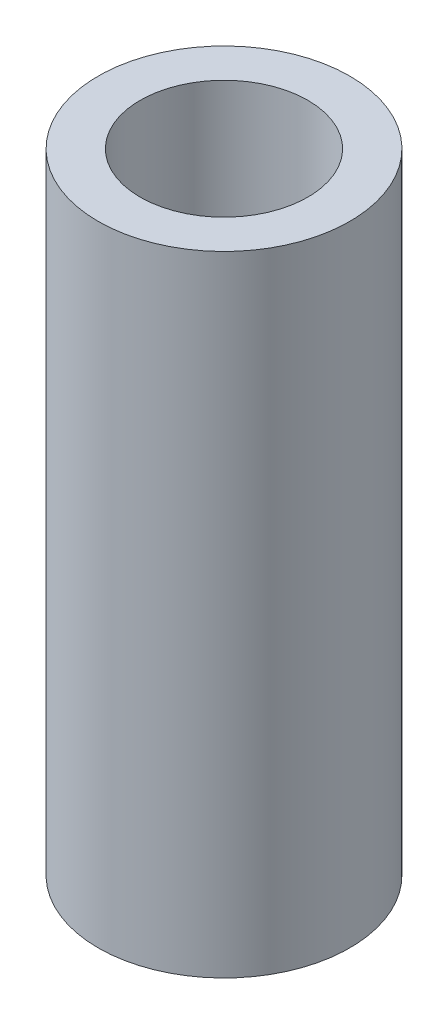
ISO-10303-21;
HEADER;
FILE_DESCRIPTION(('STEP AP214'),'2;1');
FILE_NAME('part.step','',(''),(''),'','','');
FILE_SCHEMA(('AUTOMOTIVE_DESIGN { 1 0 10303 214 1 1 1 1 }'));
ENDSEC;
DATA;
#1=APPLICATION_CONTEXT('core data for automotive mechanical design processes');
#2=APPLICATION_PROTOCOL_DEFINITION('international standard','automotive_design',2000,#1);
#3=PRODUCT_CONTEXT('',#1,'mechanical');
#4=PRODUCT('Part','Part','',(#3));
#5=PRODUCT_RELATED_PRODUCT_CATEGORY('part','',(#4));
#6=PRODUCT_DEFINITION_FORMATION('','',#4);
#7=PRODUCT_DEFINITION_CONTEXT('part definition',#1,'design');
#8=PRODUCT_DEFINITION('design','',#6,#7);
#9=PRODUCT_DEFINITION_SHAPE('','',#8);
#10=(LENGTH_UNIT() NAMED_UNIT(*) SI_UNIT(.MILLI.,.METRE.));
#11=(NAMED_UNIT(*) PLANE_ANGLE_UNIT() SI_UNIT($,.RADIAN.));
#12=(NAMED_UNIT(*) SI_UNIT($,.STERADIAN.) SOLID_ANGLE_UNIT());
#13=UNCERTAINTY_MEASURE_WITH_UNIT(LENGTH_MEASURE(1.E-05),#10,'distance_accuracy_value','');
#14=(GEOMETRIC_REPRESENTATION_CONTEXT(3) GLOBAL_UNCERTAINTY_ASSIGNED_CONTEXT((#13)) GLOBAL_UNIT_ASSIGNED_CONTEXT((#10,
#11,#12)) REPRESENTATION_CONTEXT('',''));
#15=CARTESIAN_POINT('',(0.,0.,0.));
#16=DIRECTION('',(0.,0.,1.));
#17=DIRECTION('',(1.,0.,0.));
#18=AXIS2_PLACEMENT_3D('',#15,#16,#17);
#19=CARTESIAN_POINT('',(0.,15.,0.));
#20=DIRECTION('',(0.,-1.,0.));
#21=DIRECTION('',(0.,0.,-1.));
#22=AXIS2_PLACEMENT_3D('',#19,#20,#21);
#23=CYLINDRICAL_SURFACE('',#22,3.);
#24=CARTESIAN_POINT('',(0.,15.,0.));
#25=DIRECTION('',(0.,1.,0.));
#26=DIRECTION('',(0.,0.,1.));
#27=AXIS2_PLACEMENT_3D('',#24,#25,#26);
#28=CIRCLE('',#27,3.);
#29=CARTESIAN_POINT('',(0.,15.,3.));
#30=VERTEX_POINT('',#29);
#31=EDGE_CURVE('E10',#30,#30,#28,.T.);
#32=ORIENTED_EDGE('',*,*,#31,.F.);
#33=EDGE_LOOP('',(#32));
#34=FACE_BOUND('',#33,.T.);
#35=CARTESIAN_POINT('',(0.,0.,0.));
#36=DIRECTION('',(0.,1.,0.));
#37=DIRECTION('',(0.,0.,1.));
#38=AXIS2_PLACEMENT_3D('',#35,#36,#37);
#39=CIRCLE('',#38,3.);
#40=CARTESIAN_POINT('',(0.,0.,3.));
#41=VERTEX_POINT('',#40);
#42=EDGE_CURVE('E42',#41,#41,#39,.T.);
#43=ORIENTED_EDGE('',*,*,#42,.T.);
#44=EDGE_LOOP('',(#43));
#45=FACE_BOUND('',#44,.T.);
#46=ADVANCED_FACE('F39',(#34,#45),#23,.T.);
#47=CARTESIAN_POINT('',(0.,15.,0.));
#48=DIRECTION('',(0.,1.,0.));
#49=DIRECTION('',(0.,0.,1.));
#50=AXIS2_PLACEMENT_3D('',#47,#48,#49);
#51=PLANE('',#50);
#52=CARTESIAN_POINT('',(0.,15.,0.));
#53=DIRECTION('',(0.,1.,0.));
#54=DIRECTION('',(0.,0.,1.));
#55=AXIS2_PLACEMENT_3D('',#52,#53,#54);
#56=CIRCLE('',#55,2.);
#57=CARTESIAN_POINT('',(0.,15.,2.));
#58=VERTEX_POINT('',#57);
#59=EDGE_CURVE('E53',#58,#58,#56,.T.);
#60=ORIENTED_EDGE('',*,*,#59,.F.);
#61=EDGE_LOOP('',(#60));
#62=FACE_BOUND('',#61,.T.);
#63=ORIENTED_EDGE('',*,*,#31,.T.);
#64=EDGE_LOOP('',(#63));
#65=FACE_BOUND('',#64,.T.);
#66=ADVANCED_FACE('F70',(#62,#65),#51,.T.);
#67=CARTESIAN_POINT('',(0.,0.,0.));
#68=DIRECTION('',(0.,1.,0.));
#69=DIRECTION('',(0.,0.,1.));
#70=AXIS2_PLACEMENT_3D('',#67,#68,#69);
#71=PLANE('',#70);
#72=CARTESIAN_POINT('',(0.,0.,0.));
#73=DIRECTION('',(0.,1.,0.));
#74=DIRECTION('',(0.,0.,1.));
#75=AXIS2_PLACEMENT_3D('',#72,#73,#74);
#76=CIRCLE('',#75,2.);
#77=CARTESIAN_POINT('',(0.,0.,2.));
#78=VERTEX_POINT('',#77);
#79=EDGE_CURVE('E51',#78,#78,#76,.T.);
#80=ORIENTED_EDGE('',*,*,#79,.T.);
#81=EDGE_LOOP('',(#80));
#82=FACE_BOUND('',#81,.T.);
#83=ORIENTED_EDGE('',*,*,#42,.F.);
#84=EDGE_LOOP('',(#83));
#85=FACE_BOUND('',#84,.T.);
#86=ADVANCED_FACE('F61',(#82,#85),#71,.F.);
#87=CARTESIAN_POINT('',(0.,0.,0.));
#88=DIRECTION('',(0.,1.,0.));
#89=DIRECTION('',(0.,0.,1.));
#90=AXIS2_PLACEMENT_3D('',#87,#88,#89);
#91=CYLINDRICAL_SURFACE('',#90,2.);
#92=ORIENTED_EDGE('',*,*,#79,.F.);
#93=EDGE_LOOP('',(#92));
#94=FACE_BOUND('',#93,.T.);
#95=ORIENTED_EDGE('',*,*,#59,.T.);
#96=EDGE_LOOP('',(#95));
#97=FACE_BOUND('',#96,.T.);
#98=ADVANCED_FACE('F64',(#94,#97),#91,.F.);
#99=CLOSED_SHELL('',(#46,#66,#86,#98));
#100=MANIFOLD_SOLID_BREP('B2',#99);
#101=ADVANCED_BREP_SHAPE_REPRESENTATION('',(#18,#100),#14);
#102=SHAPE_DEFINITION_REPRESENTATION(#9,#101);
ENDSEC;
END-ISO-10303-21;
